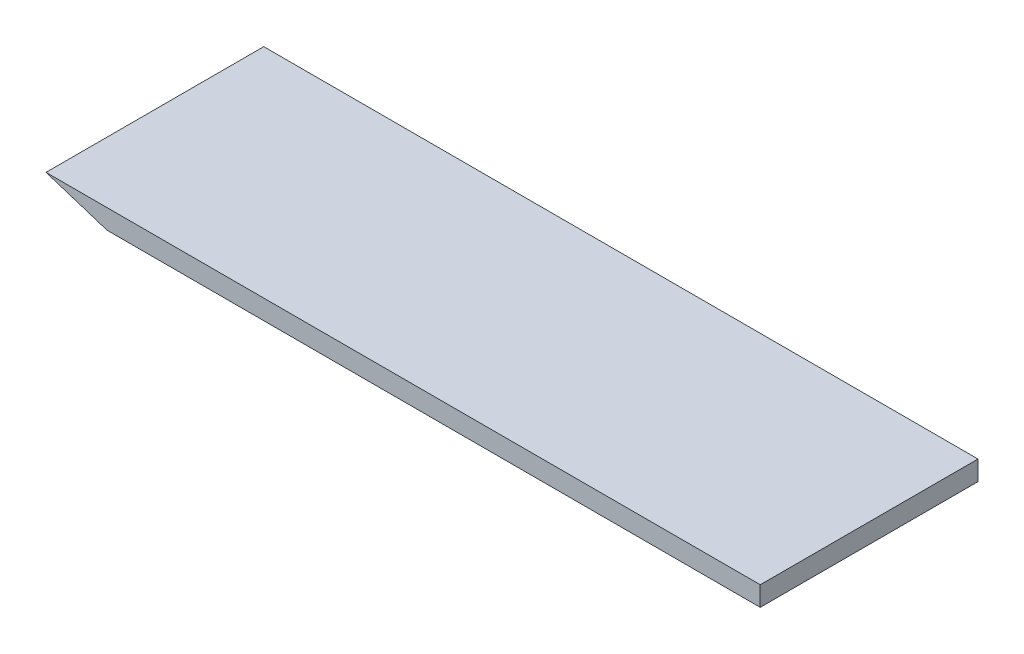
ISO-10303-21;
HEADER;
FILE_DESCRIPTION(('STEP AP214'),'2;1');
FILE_NAME('part.step','',(''),(''),'','','');
FILE_SCHEMA(('AUTOMOTIVE_DESIGN { 1 0 10303 214 1 1 1 1 }'));
ENDSEC;
DATA;
#1=APPLICATION_CONTEXT('core data for automotive mechanical design processes');
#2=APPLICATION_PROTOCOL_DEFINITION('international standard','automotive_design',2000,#1);
#3=PRODUCT_CONTEXT('',#1,'mechanical');
#4=PRODUCT('Part','Part','',(#3));
#5=PRODUCT_RELATED_PRODUCT_CATEGORY('part','',(#4));
#6=PRODUCT_DEFINITION_FORMATION('','',#4);
#7=PRODUCT_DEFINITION_CONTEXT('part definition',#1,'design');
#8=PRODUCT_DEFINITION('design','',#6,#7);
#9=PRODUCT_DEFINITION_SHAPE('','',#8);
#10=(LENGTH_UNIT() NAMED_UNIT(*) SI_UNIT(.MILLI.,.METRE.));
#11=(NAMED_UNIT(*) PLANE_ANGLE_UNIT() SI_UNIT($,.RADIAN.));
#12=(NAMED_UNIT(*) SI_UNIT($,.STERADIAN.) SOLID_ANGLE_UNIT());
#13=UNCERTAINTY_MEASURE_WITH_UNIT(LENGTH_MEASURE(1.E-05),#10,'distance_accuracy_value','');
#14=(GEOMETRIC_REPRESENTATION_CONTEXT(3) GLOBAL_UNCERTAINTY_ASSIGNED_CONTEXT((#13)) GLOBAL_UNIT_ASSIGNED_CONTEXT((#10,
#11,#12)) REPRESENTATION_CONTEXT('',''));
#15=CARTESIAN_POINT('',(0.,0.,0.));
#16=DIRECTION('',(0.,0.,1.));
#17=DIRECTION('',(1.,0.,0.));
#18=AXIS2_PLACEMENT_3D('',#15,#16,#17);
#19=CARTESIAN_POINT('',(328.,-9.00000000000001,100.));
#20=DIRECTION('',(0.,-1.,0.));
#21=DIRECTION('',(1.,0.,0.));
#22=AXIS2_PLACEMENT_3D('',#19,#20,#21);
#23=PLANE('',#22);
#24=DIRECTION('',(-1.,0.,0.));
#25=VECTOR('',#24,1.);
#26=CARTESIAN_POINT('',(328.,-9.00000000000001,0.));
#27=LINE('',#26,#25);
#28=CARTESIAN_POINT('',(328.,-9.00000000000001,0.));
#29=VERTEX_POINT('',#28);
#30=CARTESIAN_POINT('',(28.,-9.00000000000004,0.));
#31=VERTEX_POINT('',#30);
#32=EDGE_CURVE('E109',#29,#31,#27,.T.);
#33=ORIENTED_EDGE('',*,*,#32,.F.);
#34=DIRECTION('',(0.,0.,-1.));
#35=VECTOR('',#34,1.);
#36=CARTESIAN_POINT('',(328.,-9.00000000000001,100.));
#37=LINE('',#36,#35);
#38=CARTESIAN_POINT('',(328.,-9.00000000000001,100.));
#39=VERTEX_POINT('',#38);
#40=EDGE_CURVE('E11',#39,#29,#37,.T.);
#41=ORIENTED_EDGE('',*,*,#40,.F.);
#42=DIRECTION('',(-1.,0.,0.));
#43=VECTOR('',#42,1.);
#44=CARTESIAN_POINT('',(328.,-9.00000000000001,100.));
#45=LINE('',#44,#43);
#46=CARTESIAN_POINT('',(28.,-9.00000000000004,100.));
#47=VERTEX_POINT('',#46);
#48=EDGE_CURVE('E101',#39,#47,#45,.T.);
#49=ORIENTED_EDGE('',*,*,#48,.T.);
#50=DIRECTION('',(0.,0.,-1.));
#51=VECTOR('',#50,1.);
#52=CARTESIAN_POINT('',(28.,-9.00000000000004,100.));
#53=LINE('',#52,#51);
#54=EDGE_CURVE('E42',#47,#31,#53,.T.);
#55=ORIENTED_EDGE('',*,*,#54,.T.);
#56=EDGE_LOOP('',(#33,#41,#49,#55));
#57=FACE_BOUND('',#56,.T.);
#58=ADVANCED_FACE('F39',(#57),#23,.T.);
#59=CARTESIAN_POINT('',(328.,0.,100.));
#60=DIRECTION('',(1.,0.,0.));
#61=DIRECTION('',(0.,0.,-1.));
#62=AXIS2_PLACEMENT_3D('',#59,#60,#61);
#63=PLANE('',#62);
#64=DIRECTION('',(0.,-1.,0.));
#65=VECTOR('',#64,1.);
#66=CARTESIAN_POINT('',(328.,0.,0.));
#67=LINE('',#66,#65);
#68=CARTESIAN_POINT('',(328.,0.,0.));
#69=VERTEX_POINT('',#68);
#70=EDGE_CURVE('E104',#69,#29,#67,.T.);
#71=ORIENTED_EDGE('',*,*,#70,.F.);
#72=DIRECTION('',(0.,0.,-1.));
#73=VECTOR('',#72,1.);
#74=CARTESIAN_POINT('',(328.,0.,100.));
#75=LINE('',#74,#73);
#76=CARTESIAN_POINT('',(328.,0.,100.));
#77=VERTEX_POINT('',#76);
#78=EDGE_CURVE('E49',#77,#69,#75,.T.);
#79=ORIENTED_EDGE('',*,*,#78,.F.);
#80=DIRECTION('',(0.,-1.,0.));
#81=VECTOR('',#80,1.);
#82=CARTESIAN_POINT('',(328.,0.,100.));
#83=LINE('',#82,#81);
#84=EDGE_CURVE('E96',#77,#39,#83,.T.);
#85=ORIENTED_EDGE('',*,*,#84,.T.);
#86=ORIENTED_EDGE('',*,*,#40,.T.);
#87=EDGE_LOOP('',(#71,#79,#85,#86));
#88=FACE_BOUND('',#87,.T.);
#89=ADVANCED_FACE('F125',(#88),#63,.T.);
#90=CARTESIAN_POINT('',(0.,0.,100.));
#91=DIRECTION('',(0.,1.,0.));
#92=DIRECTION('',(0.,0.,1.));
#93=AXIS2_PLACEMENT_3D('',#90,#91,#92);
#94=PLANE('',#93);
#95=DIRECTION('',(1.,0.,0.));
#96=VECTOR('',#95,1.);
#97=CARTESIAN_POINT('',(0.,0.,0.));
#98=LINE('',#97,#96);
#99=CARTESIAN_POINT('',(0.,0.,0.));
#100=VERTEX_POINT('',#99);
#101=EDGE_CURVE('E90',#100,#69,#98,.T.);
#102=ORIENTED_EDGE('',*,*,#101,.F.);
#103=DIRECTION('',(0.,0.,-1.));
#104=VECTOR('',#103,1.);
#105=CARTESIAN_POINT('',(0.,0.,100.));
#106=LINE('',#105,#104);
#107=CARTESIAN_POINT('',(0.,0.,100.));
#108=VERTEX_POINT('',#107);
#109=EDGE_CURVE('E85',#108,#100,#106,.T.);
#110=ORIENTED_EDGE('',*,*,#109,.F.);
#111=DIRECTION('',(1.,0.,0.));
#112=VECTOR('',#111,1.);
#113=CARTESIAN_POINT('',(0.,0.,100.));
#114=LINE('',#113,#112);
#115=EDGE_CURVE('E88',#108,#77,#114,.T.);
#116=ORIENTED_EDGE('',*,*,#115,.T.);
#117=ORIENTED_EDGE('',*,*,#78,.T.);
#118=EDGE_LOOP('',(#102,#110,#116,#117));
#119=FACE_BOUND('',#118,.T.);
#120=ADVANCED_FACE('F87',(#119),#94,.T.);
#121=CARTESIAN_POINT('',(28.,-9.00000000000004,100.));
#122=DIRECTION('',(-0.306009180413122,-0.952028561285264,0.));
#123=DIRECTION('',(0.952028561285264,-0.306009180413122,0.));
#124=AXIS2_PLACEMENT_3D('',#121,#122,#123);
#125=PLANE('',#124);
#126=DIRECTION('',(-0.952028561285264,0.306009180413122,0.));
#127=VECTOR('',#126,1.);
#128=CARTESIAN_POINT('',(28.,-9.00000000000004,0.));
#129=LINE('',#128,#127);
#130=EDGE_CURVE('E113',#31,#100,#129,.T.);
#131=ORIENTED_EDGE('',*,*,#130,.F.);
#132=ORIENTED_EDGE('',*,*,#54,.F.);
#133=DIRECTION('',(-0.952028561285264,0.306009180413122,0.));
#134=VECTOR('',#133,1.);
#135=CARTESIAN_POINT('',(28.,-9.00000000000004,100.));
#136=LINE('',#135,#134);
#137=EDGE_CURVE('E95',#47,#108,#136,.T.);
#138=ORIENTED_EDGE('',*,*,#137,.T.);
#139=ORIENTED_EDGE('',*,*,#109,.T.);
#140=EDGE_LOOP('',(#131,#132,#138,#139));
#141=FACE_BOUND('',#140,.T.);
#142=ADVANCED_FACE('F99',(#141),#125,.T.);
#143=CARTESIAN_POINT('',(0.,0.,100.));
#144=DIRECTION('',(0.,0.,1.));
#145=DIRECTION('',(1.,0.,0.));
#146=AXIS2_PLACEMENT_3D('',#143,#144,#145);
#147=PLANE('',#146);
#148=ORIENTED_EDGE('',*,*,#48,.F.);
#149=ORIENTED_EDGE('',*,*,#84,.F.);
#150=ORIENTED_EDGE('',*,*,#115,.F.);
#151=ORIENTED_EDGE('',*,*,#137,.F.);
#152=EDGE_LOOP('',(#148,#149,#150,#151));
#153=FACE_BOUND('',#152,.T.);
#154=ADVANCED_FACE('F94',(#153),#147,.T.);
#155=CARTESIAN_POINT('',(0.,0.,0.));
#156=DIRECTION('',(0.,0.,1.));
#157=DIRECTION('',(1.,0.,0.));
#158=AXIS2_PLACEMENT_3D('',#155,#156,#157);
#159=PLANE('',#158);
#160=ORIENTED_EDGE('',*,*,#32,.T.);
#161=ORIENTED_EDGE('',*,*,#130,.T.);
#162=ORIENTED_EDGE('',*,*,#101,.T.);
#163=ORIENTED_EDGE('',*,*,#70,.T.);
#164=EDGE_LOOP('',(#160,#161,#162,#163));
#165=FACE_BOUND('',#164,.T.);
#166=ADVANCED_FACE('F124',(#165),#159,.F.);
#167=CLOSED_SHELL('',(#58,#89,#120,#142,#154,#166));
#168=MANIFOLD_SOLID_BREP('B2',#167);
#169=ADVANCED_BREP_SHAPE_REPRESENTATION('',(#18,#168),#14);
#170=SHAPE_DEFINITION_REPRESENTATION(#9,#169);
ENDSEC;
END-ISO-10303-21;
